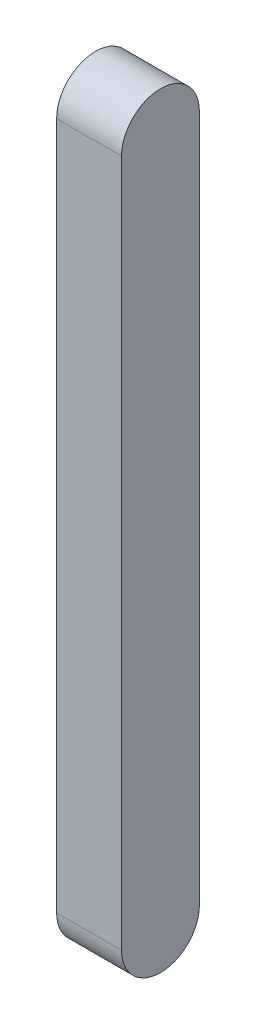
ISO-10303-21;
HEADER;
FILE_DESCRIPTION(('STEP AP214'),'2;1');
FILE_NAME('part.step','',(''),(''),'','','');
FILE_SCHEMA(('AUTOMOTIVE_DESIGN { 1 0 10303 214 1 1 1 1 }'));
ENDSEC;
DATA;
#1=APPLICATION_CONTEXT('core data for automotive mechanical design processes');
#2=APPLICATION_PROTOCOL_DEFINITION('international standard','automotive_design',2000,#1);
#3=PRODUCT_CONTEXT('',#1,'mechanical');
#4=PRODUCT('Part','Part','',(#3));
#5=PRODUCT_RELATED_PRODUCT_CATEGORY('part','',(#4));
#6=PRODUCT_DEFINITION_FORMATION('','',#4);
#7=PRODUCT_DEFINITION_CONTEXT('part definition',#1,'design');
#8=PRODUCT_DEFINITION('design','',#6,#7);
#9=PRODUCT_DEFINITION_SHAPE('','',#8);
#10=(LENGTH_UNIT() NAMED_UNIT(*) SI_UNIT(.MILLI.,.METRE.));
#11=(NAMED_UNIT(*) PLANE_ANGLE_UNIT() SI_UNIT($,.RADIAN.));
#12=(NAMED_UNIT(*) SI_UNIT($,.STERADIAN.) SOLID_ANGLE_UNIT());
#13=UNCERTAINTY_MEASURE_WITH_UNIT(LENGTH_MEASURE(1.E-05),#10,'distance_accuracy_value','');
#14=(GEOMETRIC_REPRESENTATION_CONTEXT(3) GLOBAL_UNCERTAINTY_ASSIGNED_CONTEXT((#13)) GLOBAL_UNIT_ASSIGNED_CONTEXT((#10,
#11,#12)) REPRESENTATION_CONTEXT('',''));
#15=CARTESIAN_POINT('',(0.,0.,0.));
#16=DIRECTION('',(0.,0.,1.));
#17=DIRECTION('',(1.,0.,0.));
#18=AXIS2_PLACEMENT_3D('',#15,#16,#17);
#19=CARTESIAN_POINT('',(20.,0.,0.));
#20=DIRECTION('',(-1.,0.,0.));
#21=DIRECTION('',(0.,0.,1.));
#22=AXIS2_PLACEMENT_3D('',#19,#20,#21);
#23=CYLINDRICAL_SURFACE('',#22,12.);
#24=CARTESIAN_POINT('',(0.,0.,0.));
#25=DIRECTION('',(1.,0.,0.));
#26=DIRECTION('',(0.,0.,-1.));
#27=AXIS2_PLACEMENT_3D('',#24,#25,#26);
#28=CIRCLE('',#27,12.);
#29=CARTESIAN_POINT('',(0.,0.,-12.));
#30=VERTEX_POINT('',#29);
#31=CARTESIAN_POINT('',(0.,0.,12.));
#32=VERTEX_POINT('',#31);
#33=EDGE_CURVE('E102',#30,#32,#28,.T.);
#34=ORIENTED_EDGE('',*,*,#33,.T.);
#35=DIRECTION('',(-1.,0.,0.));
#36=VECTOR('',#35,1.);
#37=CARTESIAN_POINT('',(20.,0.,12.));
#38=LINE('',#37,#36);
#39=CARTESIAN_POINT('',(20.,0.,12.));
#40=VERTEX_POINT('',#39);
#41=EDGE_CURVE('E11',#40,#32,#38,.T.);
#42=ORIENTED_EDGE('',*,*,#41,.F.);
#43=CARTESIAN_POINT('',(20.,0.,0.));
#44=DIRECTION('',(1.,0.,0.));
#45=DIRECTION('',(0.,0.,-1.));
#46=AXIS2_PLACEMENT_3D('',#43,#44,#45);
#47=CIRCLE('',#46,12.);
#48=CARTESIAN_POINT('',(20.,0.,-12.));
#49=VERTEX_POINT('',#48);
#50=EDGE_CURVE('E90',#49,#40,#47,.T.);
#51=ORIENTED_EDGE('',*,*,#50,.F.);
#52=DIRECTION('',(-1.,0.,0.));
#53=VECTOR('',#52,1.);
#54=CARTESIAN_POINT('',(20.,0.,-12.));
#55=LINE('',#54,#53);
#56=EDGE_CURVE('E98',#49,#30,#55,.T.);
#57=ORIENTED_EDGE('',*,*,#56,.T.);
#58=EDGE_LOOP('',(#34,#42,#51,#57));
#59=FACE_BOUND('',#58,.T.);
#60=ADVANCED_FACE('F39',(#59),#23,.T.);
#61=CARTESIAN_POINT('',(20.,0.,12.));
#62=DIRECTION('',(0.,0.,-1.));
#63=DIRECTION('',(0.,1.,0.));
#64=AXIS2_PLACEMENT_3D('',#61,#62,#63);
#65=PLANE('',#64);
#66=DIRECTION('',(0.,-1.,0.));
#67=VECTOR('',#66,1.);
#68=CARTESIAN_POINT('',(0.,0.,12.));
#69=LINE('',#68,#67);
#70=CARTESIAN_POINT('',(0.,-212.,12.));
#71=VERTEX_POINT('',#70);
#72=EDGE_CURVE('E94',#32,#71,#69,.T.);
#73=ORIENTED_EDGE('',*,*,#72,.T.);
#74=DIRECTION('',(-1.,0.,0.));
#75=VECTOR('',#74,1.);
#76=CARTESIAN_POINT('',(20.,-212.,12.));
#77=LINE('',#76,#75);
#78=CARTESIAN_POINT('',(20.,-212.,12.));
#79=VERTEX_POINT('',#78);
#80=EDGE_CURVE('E47',#79,#71,#77,.T.);
#81=ORIENTED_EDGE('',*,*,#80,.F.);
#82=DIRECTION('',(0.,-1.,0.));
#83=VECTOR('',#82,1.);
#84=CARTESIAN_POINT('',(20.,0.,12.));
#85=LINE('',#84,#83);
#86=EDGE_CURVE('E85',#40,#79,#85,.T.);
#87=ORIENTED_EDGE('',*,*,#86,.F.);
#88=ORIENTED_EDGE('',*,*,#41,.T.);
#89=EDGE_LOOP('',(#73,#81,#87,#88));
#90=FACE_BOUND('',#89,.T.);
#91=ADVANCED_FACE('F93',(#90),#65,.F.);
#92=CARTESIAN_POINT('',(20.,-212.,0.));
#93=DIRECTION('',(-1.,0.,0.));
#94=DIRECTION('',(0.,0.,1.));
#95=AXIS2_PLACEMENT_3D('',#92,#93,#94);
#96=CYLINDRICAL_SURFACE('',#95,12.);
#97=CARTESIAN_POINT('',(0.,-212.,0.));
#98=DIRECTION('',(1.,0.,0.));
#99=DIRECTION('',(0.,0.,-1.));
#100=AXIS2_PLACEMENT_3D('',#97,#98,#99);
#101=CIRCLE('',#100,12.);
#102=CARTESIAN_POINT('',(0.,-212.,-12.));
#103=VERTEX_POINT('',#102);
#104=EDGE_CURVE('E72',#71,#103,#101,.T.);
#105=ORIENTED_EDGE('',*,*,#104,.T.);
#106=DIRECTION('',(-1.,0.,0.));
#107=VECTOR('',#106,1.);
#108=CARTESIAN_POINT('',(20.,-212.,-12.));
#109=LINE('',#108,#107);
#110=CARTESIAN_POINT('',(20.,-212.,-12.));
#111=VERTEX_POINT('',#110);
#112=EDGE_CURVE('E95',#111,#103,#109,.T.);
#113=ORIENTED_EDGE('',*,*,#112,.F.);
#114=CARTESIAN_POINT('',(20.,-212.,0.));
#115=DIRECTION('',(1.,0.,0.));
#116=DIRECTION('',(0.,0.,-1.));
#117=AXIS2_PLACEMENT_3D('',#114,#115,#116);
#118=CIRCLE('',#117,12.);
#119=EDGE_CURVE('E88',#79,#111,#118,.T.);
#120=ORIENTED_EDGE('',*,*,#119,.F.);
#121=ORIENTED_EDGE('',*,*,#80,.T.);
#122=EDGE_LOOP('',(#105,#113,#120,#121));
#123=FACE_BOUND('',#122,.T.);
#124=ADVANCED_FACE('F96',(#123),#96,.T.);
#125=CARTESIAN_POINT('',(20.,0.,-12.));
#126=DIRECTION('',(0.,0.,1.));
#127=DIRECTION('',(0.,-1.,0.));
#128=AXIS2_PLACEMENT_3D('',#125,#126,#127);
#129=PLANE('',#128);
#130=DIRECTION('',(0.,1.,0.));
#131=VECTOR('',#130,1.);
#132=CARTESIAN_POINT('',(0.,0.,-12.));
#133=LINE('',#132,#131);
#134=EDGE_CURVE('E78',#103,#30,#133,.T.);
#135=ORIENTED_EDGE('',*,*,#134,.T.);
#136=ORIENTED_EDGE('',*,*,#56,.F.);
#137=DIRECTION('',(0.,1.,0.));
#138=VECTOR('',#137,1.);
#139=CARTESIAN_POINT('',(20.,0.,-12.));
#140=LINE('',#139,#138);
#141=EDGE_CURVE('E55',#111,#49,#140,.T.);
#142=ORIENTED_EDGE('',*,*,#141,.F.);
#143=ORIENTED_EDGE('',*,*,#112,.T.);
#144=EDGE_LOOP('',(#135,#136,#142,#143));
#145=FACE_BOUND('',#144,.T.);
#146=ADVANCED_FACE('F109',(#145),#129,.F.);
#147=CARTESIAN_POINT('',(20.,0.,0.));
#148=DIRECTION('',(1.,0.,0.));
#149=DIRECTION('',(0.,0.,-1.));
#150=AXIS2_PLACEMENT_3D('',#147,#148,#149);
#151=PLANE('',#150);
#152=ORIENTED_EDGE('',*,*,#50,.T.);
#153=ORIENTED_EDGE('',*,*,#86,.T.);
#154=ORIENTED_EDGE('',*,*,#119,.T.);
#155=ORIENTED_EDGE('',*,*,#141,.T.);
#156=EDGE_LOOP('',(#152,#153,#154,#155));
#157=FACE_BOUND('',#156,.T.);
#158=ADVANCED_FACE('F86',(#157),#151,.T.);
#159=CARTESIAN_POINT('',(0.,0.,0.));
#160=DIRECTION('',(1.,0.,0.));
#161=DIRECTION('',(0.,0.,-1.));
#162=AXIS2_PLACEMENT_3D('',#159,#160,#161);
#163=PLANE('',#162);
#164=ORIENTED_EDGE('',*,*,#33,.F.);
#165=ORIENTED_EDGE('',*,*,#134,.F.);
#166=ORIENTED_EDGE('',*,*,#104,.F.);
#167=ORIENTED_EDGE('',*,*,#72,.F.);
#168=EDGE_LOOP('',(#164,#165,#166,#167));
#169=FACE_BOUND('',#168,.T.);
#170=ADVANCED_FACE('F112',(#169),#163,.F.);
#171=CLOSED_SHELL('',(#60,#91,#124,#146,#158,#170));
#172=MANIFOLD_SOLID_BREP('B2',#171);
#173=ADVANCED_BREP_SHAPE_REPRESENTATION('',(#18,#172),#14);
#174=SHAPE_DEFINITION_REPRESENTATION(#9,#173);
ENDSEC;
END-ISO-10303-21;
